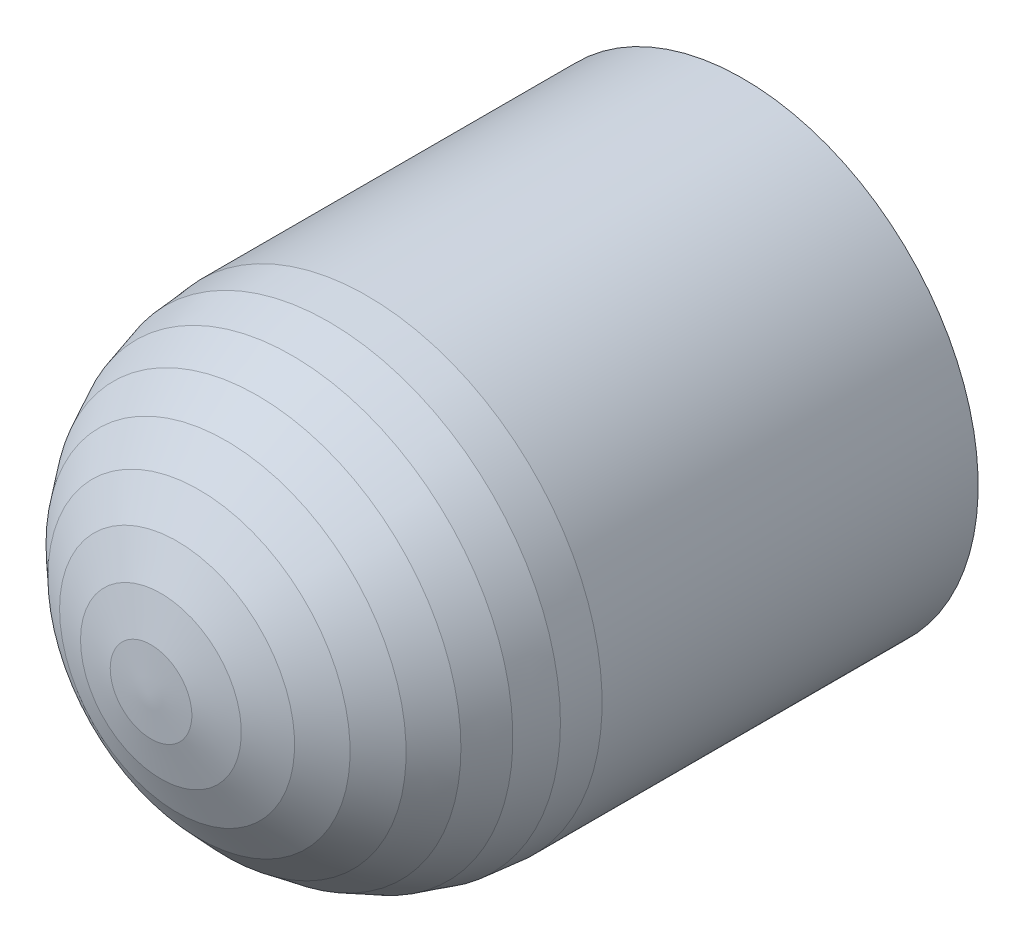
ISO-10303-21;
HEADER;
FILE_DESCRIPTION(('STEP AP214'),'2;1');
FILE_NAME('part.step','',(''),(''),'','','');
FILE_SCHEMA(('AUTOMOTIVE_DESIGN { 1 0 10303 214 1 1 1 1 }'));
ENDSEC;
DATA;
#1=APPLICATION_CONTEXT('core data for automotive mechanical design processes');
#2=APPLICATION_PROTOCOL_DEFINITION('international standard','automotive_design',2000,#1);
#3=PRODUCT_CONTEXT('',#1,'mechanical');
#4=PRODUCT('Part','Part','',(#3));
#5=PRODUCT_RELATED_PRODUCT_CATEGORY('part','',(#4));
#6=PRODUCT_DEFINITION_FORMATION('','',#4);
#7=PRODUCT_DEFINITION_CONTEXT('part definition',#1,'design');
#8=PRODUCT_DEFINITION('design','',#6,#7);
#9=PRODUCT_DEFINITION_SHAPE('','',#8);
#10=(LENGTH_UNIT() NAMED_UNIT(*) SI_UNIT(.MILLI.,.METRE.));
#11=(NAMED_UNIT(*) PLANE_ANGLE_UNIT() SI_UNIT($,.RADIAN.));
#12=(NAMED_UNIT(*) SI_UNIT($,.STERADIAN.) SOLID_ANGLE_UNIT());
#13=UNCERTAINTY_MEASURE_WITH_UNIT(LENGTH_MEASURE(1.E-05),#10,'distance_accuracy_value','');
#14=(GEOMETRIC_REPRESENTATION_CONTEXT(3) GLOBAL_UNCERTAINTY_ASSIGNED_CONTEXT((#13)) GLOBAL_UNIT_ASSIGNED_CONTEXT((#10,
#11,#12)) REPRESENTATION_CONTEXT('',''));
#15=CARTESIAN_POINT('',(0.,0.,0.));
#16=DIRECTION('',(0.,0.,1.));
#17=DIRECTION('',(1.,0.,0.));
#18=AXIS2_PLACEMENT_3D('',#15,#16,#17);
#19=CARTESIAN_POINT('',(0.,0.,0.));
#20=DIRECTION('',(0.,0.,1.));
#21=DIRECTION('',(1.,0.,0.));
#22=AXIS2_PLACEMENT_3D('',#19,#20,#21);
#23=PLANE('',#22);
#24=CARTESIAN_POINT('',(0.,0.,0.));
#25=DIRECTION('',(0.,0.,-1.));
#26=DIRECTION('',(-1.,0.,0.));
#27=AXIS2_PLACEMENT_3D('',#24,#25,#26);
#28=CIRCLE('',#27,75.);
#29=CARTESIAN_POINT('',(-75.,0.,0.));
#30=VERTEX_POINT('',#29);
#31=EDGE_CURVE('E11',#30,#30,#28,.T.);
#32=ORIENTED_EDGE('',*,*,#31,.T.);
#33=EDGE_LOOP('',(#32));
#34=FACE_BOUND('',#33,.T.);
#35=ADVANCED_FACE('F39',(#34),#23,.F.);
#36=CARTESIAN_POINT('',(0.,0.,-10.));
#37=DIRECTION('',(0.,0.,-1.));
#38=DIRECTION('',(-1.,0.,0.));
#39=AXIS2_PLACEMENT_3D('',#36,#37,#38);
#40=CYLINDRICAL_SURFACE('',#39,75.);
#41=ORIENTED_EDGE('',*,*,#31,.F.);
#42=EDGE_LOOP('',(#41));
#43=FACE_BOUND('',#42,.T.);
#44=CARTESIAN_POINT('',(0.,0.,120.));
#45=DIRECTION('',(0.,0.,-1.));
#46=DIRECTION('',(-1.,0.,0.));
#47=AXIS2_PLACEMENT_3D('',#44,#45,#46);
#48=CIRCLE('',#47,75.);
#49=CARTESIAN_POINT('',(-75.,0.,120.));
#50=VERTEX_POINT('',#49);
#51=EDGE_CURVE('E45',#50,#50,#48,.T.);
#52=ORIENTED_EDGE('',*,*,#51,.T.);
#53=EDGE_LOOP('',(#52));
#54=FACE_BOUND('',#53,.T.);
#55=ADVANCED_FACE('F61',(#43,#54),#40,.T.);
#56=CARTESIAN_POINT('',(0.,0.,132.155372436685));
#57=DIRECTION('',(0.,0.,-1.));
#58=DIRECTION('',(-1.,0.,0.));
#59=AXIS2_PLACEMENT_3D('',#56,#57,#58);
#60=CONICAL_SURFACE('',#59,73.8605814759156,0.0934647407465896);
#61=ORIENTED_EDGE('',*,*,#51,.F.);
#62=EDGE_LOOP('',(#61));
#63=FACE_BOUND('',#62,.T.);
#64=CARTESIAN_POINT('',(0.,0.,132.155372436685));
#65=DIRECTION('',(0.,0.,-1.));
#66=DIRECTION('',(-1.,0.,0.));
#67=AXIS2_PLACEMENT_3D('',#64,#65,#66);
#68=CIRCLE('',#67,73.8605814759156);
#69=CARTESIAN_POINT('',(-73.8605814759156,0.,132.155372436685));
#70=VERTEX_POINT('',#69);
#71=EDGE_CURVE('E73',#70,#70,#68,.T.);
#72=ORIENTED_EDGE('',*,*,#71,.T.);
#73=EDGE_LOOP('',(#72));
#74=FACE_BOUND('',#73,.T.);
#75=ADVANCED_FACE('F66',(#63,#74),#60,.T.);
#76=CARTESIAN_POINT('',(0.,0.,143.941410032797));
#77=DIRECTION('',(0.,0.,-1.));
#78=DIRECTION('',(-1.,0.,0.));
#79=AXIS2_PLACEMENT_3D('',#76,#77,#78);
#80=CONICAL_SURFACE('',#79,70.4769465589431,0.279569623816372);
#81=ORIENTED_EDGE('',*,*,#71,.F.);
#82=EDGE_LOOP('',(#81));
#83=FACE_BOUND('',#82,.T.);
#84=CARTESIAN_POINT('',(0.,0.,143.941410032797));
#85=DIRECTION('',(0.,0.,-1.));
#86=DIRECTION('',(-1.,0.,0.));
#87=AXIS2_PLACEMENT_3D('',#84,#85,#86);
#88=CIRCLE('',#87,70.4769465589431);
#89=CARTESIAN_POINT('',(-70.4769465589431,0.,143.941410032797));
#90=VERTEX_POINT('',#89);
#91=EDGE_CURVE('E75',#90,#90,#88,.T.);
#92=ORIENTED_EDGE('',*,*,#91,.T.);
#93=EDGE_LOOP('',(#92));
#94=FACE_BOUND('',#93,.T.);
#95=ADVANCED_FACE('F122',(#83,#94),#80,.T.);
#96=CARTESIAN_POINT('',(0.,0.,155.));
#97=DIRECTION('',(0.,0.,-1.));
#98=DIRECTION('',(-1.,0.,0.));
#99=AXIS2_PLACEMENT_3D('',#96,#97,#98);
#100=CONICAL_SURFACE('',#99,64.9519052838329,0.463339840075521);
#101=ORIENTED_EDGE('',*,*,#91,.F.);
#102=EDGE_LOOP('',(#101));
#103=FACE_BOUND('',#102,.T.);
#104=CARTESIAN_POINT('',(0.,0.,155.));
#105=DIRECTION('',(0.,0.,-1.));
#106=DIRECTION('',(-1.,0.,0.));
#107=AXIS2_PLACEMENT_3D('',#104,#105,#106);
#108=CIRCLE('',#107,64.9519052838329);
#109=CARTESIAN_POINT('',(-64.9519052838329,0.,155.));
#110=VERTEX_POINT('',#109);
#111=EDGE_CURVE('E80',#110,#110,#108,.T.);
#112=ORIENTED_EDGE('',*,*,#111,.T.);
#113=EDGE_LOOP('',(#112));
#114=FACE_BOUND('',#113,.T.);
#115=ADVANCED_FACE('F118',(#103,#114),#100,.T.);
#116=CARTESIAN_POINT('',(0.,0.,164.995132678058));
#117=DIRECTION('',(0.,0.,-1.));
#118=DIRECTION('',(-1.,0.,0.));
#119=AXIS2_PLACEMENT_3D('',#116,#117,#118);
#120=CONICAL_SURFACE('',#119,57.4533332339234,0.643643405519663);
#121=ORIENTED_EDGE('',*,*,#111,.F.);
#122=EDGE_LOOP('',(#121));
#123=FACE_BOUND('',#122,.T.);
#124=CARTESIAN_POINT('',(0.,0.,164.995132678058));
#125=DIRECTION('',(0.,0.,-1.));
#126=DIRECTION('',(-1.,0.,0.));
#127=AXIS2_PLACEMENT_3D('',#124,#125,#126);
#128=CIRCLE('',#127,57.4533332339234);
#129=CARTESIAN_POINT('',(-57.4533332339234,0.,164.995132678058));
#130=VERTEX_POINT('',#129);
#131=EDGE_CURVE('E83',#130,#130,#128,.T.);
#132=ORIENTED_EDGE('',*,*,#131,.T.);
#133=EDGE_LOOP('',(#132));
#134=FACE_BOUND('',#133,.T.);
#135=ADVANCED_FACE('F114',(#123,#134),#120,.T.);
#136=CARTESIAN_POINT('',(0.,0.,173.623111018328));
#137=DIRECTION('',(0.,0.,-1.));
#138=DIRECTION('',(-1.,0.,0.));
#139=AXIS2_PLACEMENT_3D('',#136,#137,#138);
#140=CONICAL_SURFACE('',#139,48.2090707264905,0.819867264396956);
#141=ORIENTED_EDGE('',*,*,#131,.F.);
#142=EDGE_LOOP('',(#141));
#143=FACE_BOUND('',#142,.T.);
#144=CARTESIAN_POINT('',(0.,0.,173.623111018328));
#145=DIRECTION('',(0.,0.,-1.));
#146=DIRECTION('',(-1.,0.,0.));
#147=AXIS2_PLACEMENT_3D('',#144,#145,#146);
#148=CIRCLE('',#147,48.2090707264905);
#149=CARTESIAN_POINT('',(-48.2090707264905,0.,173.623111018328));
#150=VERTEX_POINT('',#149);
#151=EDGE_CURVE('E86',#150,#150,#148,.T.);
#152=ORIENTED_EDGE('',*,*,#151,.T.);
#153=EDGE_LOOP('',(#152));
#154=FACE_BOUND('',#153,.T.);
#155=ADVANCED_FACE('F107',(#143,#154),#140,.T.);
#156=CARTESIAN_POINT('',(0.,0.,180.621778264911));
#157=DIRECTION('',(0.,0.,-1.));
#158=DIRECTION('',(-1.,0.,0.));
#159=AXIS2_PLACEMENT_3D('',#156,#157,#158);
#160=CONICAL_SURFACE('',#159,37.5,0.991945638178197);
#161=ORIENTED_EDGE('',*,*,#151,.F.);
#162=EDGE_LOOP('',(#161));
#163=FACE_BOUND('',#162,.T.);
#164=CARTESIAN_POINT('',(0.,0.,180.621778264911));
#165=DIRECTION('',(0.,0.,-1.));
#166=DIRECTION('',(-1.,0.,0.));
#167=AXIS2_PLACEMENT_3D('',#164,#165,#166);
#168=CIRCLE('',#167,37.5);
#169=CARTESIAN_POINT('',(-37.5,0.,180.621778264911));
#170=VERTEX_POINT('',#169);
#171=EDGE_CURVE('E89',#170,#170,#168,.T.);
#172=ORIENTED_EDGE('',*,*,#171,.T.);
#173=EDGE_LOOP('',(#172));
#174=FACE_BOUND('',#173,.T.);
#175=ADVANCED_FACE('F101',(#163,#174),#160,.T.);
#176=CARTESIAN_POINT('',(0.,0.,185.778483455014));
#177=DIRECTION('',(0.,0.,-1.));
#178=DIRECTION('',(-1.,0.,0.));
#179=AXIS2_PLACEMENT_3D('',#176,#177,#178);
#180=CONICAL_SURFACE('',#179,25.6515107494252,1.1603007870043);
#181=ORIENTED_EDGE('',*,*,#171,.F.);
#182=EDGE_LOOP('',(#181));
#183=FACE_BOUND('',#182,.T.);
#184=CARTESIAN_POINT('',(0.,0.,185.778483455014));
#185=DIRECTION('',(0.,0.,-1.));
#186=DIRECTION('',(-1.,0.,0.));
#187=AXIS2_PLACEMENT_3D('',#184,#185,#186);
#188=CIRCLE('',#187,25.6515107494252);
#189=CARTESIAN_POINT('',(-25.6515107494252,0.,185.778483455014));
#190=VERTEX_POINT('',#189);
#191=EDGE_CURVE('E92',#190,#190,#188,.T.);
#192=ORIENTED_EDGE('',*,*,#191,.T.);
#193=EDGE_LOOP('',(#192));
#194=FACE_BOUND('',#193,.T.);
#195=ADVANCED_FACE('F56',(#183,#194),#180,.T.);
#196=CARTESIAN_POINT('',(0.,0.,188.936542710855));
#197=DIRECTION('',(0.,0.,-1.));
#198=DIRECTION('',(-1.,0.,0.));
#199=AXIS2_PLACEMENT_3D('',#196,#197,#198);
#200=CONICAL_SURFACE('',#199,13.0236133250198,1.32573680606912);
#201=ORIENTED_EDGE('',*,*,#191,.F.);
#202=EDGE_LOOP('',(#201));
#203=FACE_BOUND('',#202,.T.);
#204=CARTESIAN_POINT('',(0.,0.,188.936542710855));
#205=DIRECTION('',(0.,0.,-1.));
#206=DIRECTION('',(-1.,0.,0.));
#207=AXIS2_PLACEMENT_3D('',#204,#205,#206);
#208=CIRCLE('',#207,13.0236133250198);
#209=CARTESIAN_POINT('',(-13.0236133250198,0.,188.936542710855));
#210=VERTEX_POINT('',#209);
#211=EDGE_CURVE('E95',#210,#210,#208,.T.);
#212=ORIENTED_EDGE('',*,*,#211,.T.);
#213=EDGE_LOOP('',(#212));
#214=FACE_BOUND('',#213,.T.);
#215=ADVANCED_FACE('F50',(#203,#214),#200,.T.);
#216=CARTESIAN_POINT('',(0.,0.,190.));
#217=DIRECTION('',(0.,0.,-1.));
#218=DIRECTION('',(-1.,0.,0.));
#219=AXIS2_PLACEMENT_3D('',#216,#217,#218);
#220=CONICAL_SURFACE('',#219,0.,1.4893210047575);
#221=ORIENTED_EDGE('',*,*,#211,.F.);
#222=EDGE_LOOP('',(#221));
#223=FACE_BOUND('',#222,.T.);
#224=CARTESIAN_POINT('',(0.,0.,190.));
#225=VERTEX_POINT('',#224);
#226=VERTEX_LOOP('',#225);
#227=FACE_BOUND('',#226,.T.);
#228=ADVANCED_FACE('F48',(#223,#227),#220,.T.);
#229=CLOSED_SHELL('',(#35,#55,#75,#95,#115,#135,#155,#175,#195,#215,#228));
#230=MANIFOLD_SOLID_BREP('B2',#229);
#231=ADVANCED_BREP_SHAPE_REPRESENTATION('',(#18,#230),#14);
#232=SHAPE_DEFINITION_REPRESENTATION(#9,#231);
ENDSEC;
END-ISO-10303-21;
